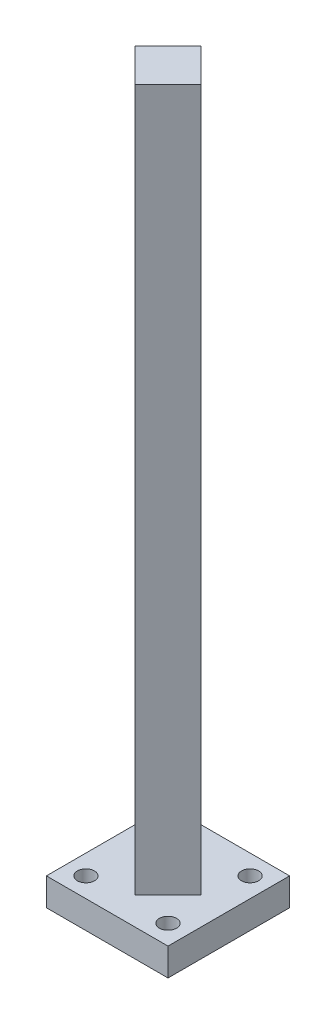
ISO-10303-21;
HEADER;
FILE_DESCRIPTION(('STEP AP214'),'2;1');
FILE_NAME('part.step','',(''),(''),'','','');
FILE_SCHEMA(('AUTOMOTIVE_DESIGN { 1 0 10303 214 1 1 1 1 }'));
ENDSEC;
DATA;
#1=APPLICATION_CONTEXT('core data for automotive mechanical design processes');
#2=APPLICATION_PROTOCOL_DEFINITION('international standard','automotive_design',2000,#1);
#3=PRODUCT_CONTEXT('',#1,'mechanical');
#4=PRODUCT('Part','Part','',(#3));
#5=PRODUCT_RELATED_PRODUCT_CATEGORY('part','',(#4));
#6=PRODUCT_DEFINITION_FORMATION('','',#4);
#7=PRODUCT_DEFINITION_CONTEXT('part definition',#1,'design');
#8=PRODUCT_DEFINITION('design','',#6,#7);
#9=PRODUCT_DEFINITION_SHAPE('','',#8);
#10=(LENGTH_UNIT() NAMED_UNIT(*) SI_UNIT(.MILLI.,.METRE.));
#11=(NAMED_UNIT(*) PLANE_ANGLE_UNIT() SI_UNIT($,.RADIAN.));
#12=(NAMED_UNIT(*) SI_UNIT($,.STERADIAN.) SOLID_ANGLE_UNIT());
#13=UNCERTAINTY_MEASURE_WITH_UNIT(LENGTH_MEASURE(1.E-05),#10,'distance_accuracy_value','');
#14=(GEOMETRIC_REPRESENTATION_CONTEXT(3) GLOBAL_UNCERTAINTY_ASSIGNED_CONTEXT((#13)) GLOBAL_UNIT_ASSIGNED_CONTEXT((#10,
#11,#12)) REPRESENTATION_CONTEXT('',''));
#15=CARTESIAN_POINT('',(0.,0.,0.));
#16=DIRECTION('',(0.,0.,1.));
#17=DIRECTION('',(1.,0.,0.));
#18=AXIS2_PLACEMENT_3D('',#15,#16,#17);
#19=CARTESIAN_POINT('',(0.,5.,0.));
#20=DIRECTION('',(0.,1.,0.));
#21=DIRECTION('',(0.,0.,1.));
#22=AXIS2_PLACEMENT_3D('',#19,#20,#21);
#23=PLANE('',#22);
#24=DIRECTION('',(-0.707106781186545,0.,-0.70710678118655));
#25=VECTOR('',#24,1.);
#26=CARTESIAN_POINT('',(6.00000000000014,5.,0.));
#27=LINE('',#26,#25);
#28=CARTESIAN_POINT('',(6.00000000000014,5.,0.));
#29=VERTEX_POINT('',#28);
#30=CARTESIAN_POINT('',(1.65523303187956E-13,5.,-6.));
#31=VERTEX_POINT('',#30);
#32=EDGE_CURVE('E55',#29,#31,#27,.T.);
#33=ORIENTED_EDGE('',*,*,#32,.F.);
#34=DIRECTION('',(0.70710678118655,0.,-0.707106781186545));
#35=VECTOR('',#34,1.);
#36=CARTESIAN_POINT('',(1.23625527121837E-13,5.,6.));
#37=LINE('',#36,#35);
#38=CARTESIAN_POINT('',(1.23625527121837E-13,5.,6.));
#39=VERTEX_POINT('',#38);
#40=EDGE_CURVE('E59',#39,#29,#37,.T.);
#41=ORIENTED_EDGE('',*,*,#40,.F.);
#42=DIRECTION('',(0.707106781186545,0.,0.70710678118655));
#43=VECTOR('',#42,1.);
#44=CARTESIAN_POINT('',(-5.99999999999986,5.,0.));
#45=LINE('',#44,#43);
#46=CARTESIAN_POINT('',(-5.99999999999986,5.,0.));
#47=VERTEX_POINT('',#46);
#48=EDGE_CURVE('E368',#47,#39,#45,.T.);
#49=ORIENTED_EDGE('',*,*,#48,.F.);
#50=DIRECTION('',(-0.70710678118655,0.,0.707106781186545));
#51=VECTOR('',#50,1.);
#52=CARTESIAN_POINT('',(1.65523303187956E-13,5.,-6.));
#53=LINE('',#52,#51);
#54=EDGE_CURVE('E378',#31,#47,#53,.T.);
#55=ORIENTED_EDGE('',*,*,#54,.F.);
#56=EDGE_LOOP('',(#33,#41,#49,#55));
#57=FACE_BOUND('',#56,.T.);
#58=CARTESIAN_POINT('',(7.42462120245917,5.,7.42462120245833));
#59=DIRECTION('',(0.,1.,0.));
#60=DIRECTION('',(0.,0.,1.));
#61=AXIS2_PLACEMENT_3D('',#58,#59,#60);
#62=CIRCLE('',#61,1.55000000000059);
#63=CARTESIAN_POINT('',(7.42462120245917,5.,8.97462120245892));
#64=VERTEX_POINT('',#63);
#65=EDGE_CURVE('E143',#64,#64,#62,.T.);
#66=ORIENTED_EDGE('',*,*,#65,.F.);
#67=EDGE_LOOP('',(#66));
#68=FACE_BOUND('',#67,.T.);
#69=CARTESIAN_POINT('',(-7.42462120245875,5.,-7.42462120245875));
#70=DIRECTION('',(0.,1.,0.));
#71=DIRECTION('',(0.,0.,1.));
#72=AXIS2_PLACEMENT_3D('',#69,#70,#71);
#73=CIRCLE('',#72,1.55);
#74=CARTESIAN_POINT('',(-7.42462120245875,5.,-5.87462120245875));
#75=VERTEX_POINT('',#74);
#76=EDGE_CURVE('E159',#75,#75,#73,.T.);
#77=ORIENTED_EDGE('',*,*,#76,.F.);
#78=EDGE_LOOP('',(#77));
#79=FACE_BOUND('',#78,.T.);
#80=DIRECTION('',(0.,0.,-1.));
#81=VECTOR('',#80,1.);
#82=CARTESIAN_POINT('',(11.,5.,-11.));
#83=LINE('',#82,#81);
#84=CARTESIAN_POINT('',(11.,5.,11.));
#85=VERTEX_POINT('',#84);
#86=CARTESIAN_POINT('',(11.,5.,-11.));
#87=VERTEX_POINT('',#86);
#88=EDGE_CURVE('E167',#85,#87,#83,.T.);
#89=ORIENTED_EDGE('',*,*,#88,.T.);
#90=DIRECTION('',(-1.,0.,0.));
#91=VECTOR('',#90,1.);
#92=CARTESIAN_POINT('',(-11.,5.,-11.));
#93=LINE('',#92,#91);
#94=CARTESIAN_POINT('',(-11.,5.,-11.));
#95=VERTEX_POINT('',#94);
#96=EDGE_CURVE('E171',#87,#95,#93,.T.);
#97=ORIENTED_EDGE('',*,*,#96,.T.);
#98=DIRECTION('',(0.,0.,1.));
#99=VECTOR('',#98,1.);
#100=CARTESIAN_POINT('',(-11.,5.,-11.));
#101=LINE('',#100,#99);
#102=CARTESIAN_POINT('',(-11.,5.,11.));
#103=VERTEX_POINT('',#102);
#104=EDGE_CURVE('E175',#95,#103,#101,.T.);
#105=ORIENTED_EDGE('',*,*,#104,.T.);
#106=DIRECTION('',(1.,0.,0.));
#107=VECTOR('',#106,1.);
#108=CARTESIAN_POINT('',(-11.,5.,11.));
#109=LINE('',#108,#107);
#110=EDGE_CURVE('E178',#103,#85,#109,.T.);
#111=ORIENTED_EDGE('',*,*,#110,.T.);
#112=EDGE_LOOP('',(#89,#97,#105,#111));
#113=FACE_BOUND('',#112,.T.);
#114=CARTESIAN_POINT('',(7.42462120245875,5.,-7.42462120245917));
#115=DIRECTION('',(0.,1.,0.));
#116=DIRECTION('',(0.,0.,1.));
#117=AXIS2_PLACEMENT_3D('',#114,#115,#116);
#118=CIRCLE('',#117,1.55000000000044);
#119=CARTESIAN_POINT('',(7.42462120245875,5.,-5.87462120245873));
#120=VERTEX_POINT('',#119);
#121=EDGE_CURVE('E151',#120,#120,#118,.T.);
#122=ORIENTED_EDGE('',*,*,#121,.F.);
#123=EDGE_LOOP('',(#122));
#124=FACE_BOUND('',#123,.T.);
#125=CARTESIAN_POINT('',(-7.42462120245833,5.,7.42462120245875));
#126=DIRECTION('',(0.,1.,0.));
#127=DIRECTION('',(0.,0.,1.));
#128=AXIS2_PLACEMENT_3D('',#125,#126,#127);
#129=CIRCLE('',#128,1.55000000000023);
#130=CARTESIAN_POINT('',(-7.42462120245833,5.,8.97462120245898));
#131=VERTEX_POINT('',#130);
#132=EDGE_CURVE('E133',#131,#131,#129,.T.);
#133=ORIENTED_EDGE('',*,*,#132,.F.);
#134=EDGE_LOOP('',(#133));
#135=FACE_BOUND('',#134,.T.);
#136=ADVANCED_FACE('F39',(#57,#68,#79,#113,#124,#135),#23,.T.);
#137=CARTESIAN_POINT('',(0.,0.,0.));
#138=DIRECTION('',(0.,1.,0.));
#139=DIRECTION('',(0.,0.,1.));
#140=AXIS2_PLACEMENT_3D('',#137,#138,#139);
#141=PLANE('',#140);
#142=DIRECTION('',(0.,0.,-1.));
#143=VECTOR('',#142,1.);
#144=CARTESIAN_POINT('',(11.,0.,-11.));
#145=LINE('',#144,#143);
#146=CARTESIAN_POINT('',(11.,0.,11.));
#147=VERTEX_POINT('',#146);
#148=CARTESIAN_POINT('',(11.,0.,-11.));
#149=VERTEX_POINT('',#148);
#150=EDGE_CURVE('E163',#147,#149,#145,.T.);
#151=ORIENTED_EDGE('',*,*,#150,.F.);
#152=DIRECTION('',(1.,0.,0.));
#153=VECTOR('',#152,1.);
#154=CARTESIAN_POINT('',(-11.,0.,11.));
#155=LINE('',#154,#153);
#156=CARTESIAN_POINT('',(-11.,0.,11.));
#157=VERTEX_POINT('',#156);
#158=EDGE_CURVE('E172',#157,#147,#155,.T.);
#159=ORIENTED_EDGE('',*,*,#158,.F.);
#160=DIRECTION('',(0.,0.,1.));
#161=VECTOR('',#160,1.);
#162=CARTESIAN_POINT('',(-11.,0.,-11.));
#163=LINE('',#162,#161);
#164=CARTESIAN_POINT('',(-11.,0.,-11.));
#165=VERTEX_POINT('',#164);
#166=EDGE_CURVE('E188',#165,#157,#163,.T.);
#167=ORIENTED_EDGE('',*,*,#166,.F.);
#168=DIRECTION('',(-1.,0.,0.));
#169=VECTOR('',#168,1.);
#170=CARTESIAN_POINT('',(-11.,0.,-11.));
#171=LINE('',#170,#169);
#172=EDGE_CURVE('E185',#149,#165,#171,.T.);
#173=ORIENTED_EDGE('',*,*,#172,.F.);
#174=EDGE_LOOP('',(#151,#159,#167,#173));
#175=FACE_BOUND('',#174,.T.);
#176=CARTESIAN_POINT('',(-7.42462120245875,0.,-7.42462120245875));
#177=DIRECTION('',(0.,1.,0.));
#178=DIRECTION('',(0.,0.,1.));
#179=AXIS2_PLACEMENT_3D('',#176,#177,#178);
#180=CIRCLE('',#179,1.55);
#181=CARTESIAN_POINT('',(-7.42462120245875,0.,-5.87462120245875));
#182=VERTEX_POINT('',#181);
#183=EDGE_CURVE('E155',#182,#182,#180,.T.);
#184=ORIENTED_EDGE('',*,*,#183,.T.);
#185=EDGE_LOOP('',(#184));
#186=FACE_BOUND('',#185,.T.);
#187=CARTESIAN_POINT('',(7.42462120245875,0.,-7.42462120245917));
#188=DIRECTION('',(0.,1.,0.));
#189=DIRECTION('',(0.,0.,1.));
#190=AXIS2_PLACEMENT_3D('',#187,#188,#189);
#191=CIRCLE('',#190,1.55000000000044);
#192=CARTESIAN_POINT('',(7.42462120245875,0.,-5.87462120245873));
#193=VERTEX_POINT('',#192);
#194=EDGE_CURVE('E147',#193,#193,#191,.T.);
#195=ORIENTED_EDGE('',*,*,#194,.T.);
#196=EDGE_LOOP('',(#195));
#197=FACE_BOUND('',#196,.T.);
#198=CARTESIAN_POINT('',(7.42462120245917,0.,7.42462120245833));
#199=DIRECTION('',(0.,1.,0.));
#200=DIRECTION('',(0.,0.,1.));
#201=AXIS2_PLACEMENT_3D('',#198,#199,#200);
#202=CIRCLE('',#201,1.55000000000059);
#203=CARTESIAN_POINT('',(7.42462120245917,0.,8.97462120245892));
#204=VERTEX_POINT('',#203);
#205=EDGE_CURVE('E141',#204,#204,#202,.T.);
#206=ORIENTED_EDGE('',*,*,#205,.T.);
#207=EDGE_LOOP('',(#206));
#208=FACE_BOUND('',#207,.T.);
#209=CARTESIAN_POINT('',(-7.42462120245833,0.,7.42462120245875));
#210=DIRECTION('',(0.,1.,0.));
#211=DIRECTION('',(0.,0.,1.));
#212=AXIS2_PLACEMENT_3D('',#209,#210,#211);
#213=CIRCLE('',#212,1.55000000000023);
#214=CARTESIAN_POINT('',(-7.42462120245833,0.,8.97462120245898));
#215=VERTEX_POINT('',#214);
#216=EDGE_CURVE('E128',#215,#215,#213,.T.);
#217=ORIENTED_EDGE('',*,*,#216,.T.);
#218=EDGE_LOOP('',(#217));
#219=FACE_BOUND('',#218,.T.);
#220=ADVANCED_FACE('F211',(#175,#186,#197,#208,#219),#141,.F.);
#221=CARTESIAN_POINT('',(11.,5.,-11.));
#222=DIRECTION('',(-1.,0.,0.));
#223=DIRECTION('',(0.,0.,1.));
#224=AXIS2_PLACEMENT_3D('',#221,#222,#223);
#225=PLANE('',#224);
#226=ORIENTED_EDGE('',*,*,#150,.T.);
#227=DIRECTION('',(0.,-1.,0.));
#228=VECTOR('',#227,1.);
#229=CARTESIAN_POINT('',(11.,5.,-11.));
#230=LINE('',#229,#228);
#231=EDGE_CURVE('E11',#87,#149,#230,.T.);
#232=ORIENTED_EDGE('',*,*,#231,.F.);
#233=ORIENTED_EDGE('',*,*,#88,.F.);
#234=DIRECTION('',(0.,-1.,0.));
#235=VECTOR('',#234,1.);
#236=CARTESIAN_POINT('',(11.,5.,11.));
#237=LINE('',#236,#235);
#238=EDGE_CURVE('E181',#85,#147,#237,.T.);
#239=ORIENTED_EDGE('',*,*,#238,.T.);
#240=EDGE_LOOP('',(#226,#232,#233,#239));
#241=FACE_BOUND('',#240,.T.);
#242=ADVANCED_FACE('F41',(#241),#225,.F.);
#243=CARTESIAN_POINT('',(-11.,5.,-11.));
#244=DIRECTION('',(0.,0.,1.));
#245=DIRECTION('',(1.,0.,0.));
#246=AXIS2_PLACEMENT_3D('',#243,#244,#245);
#247=PLANE('',#246);
#248=ORIENTED_EDGE('',*,*,#172,.T.);
#249=DIRECTION('',(0.,-1.,0.));
#250=VECTOR('',#249,1.);
#251=CARTESIAN_POINT('',(-11.,5.,-11.));
#252=LINE('',#251,#250);
#253=EDGE_CURVE('E48',#95,#165,#252,.T.);
#254=ORIENTED_EDGE('',*,*,#253,.F.);
#255=ORIENTED_EDGE('',*,*,#96,.F.);
#256=ORIENTED_EDGE('',*,*,#231,.T.);
#257=EDGE_LOOP('',(#248,#254,#255,#256));
#258=FACE_BOUND('',#257,.T.);
#259=ADVANCED_FACE('F222',(#258),#247,.F.);
#260=CARTESIAN_POINT('',(-11.,5.,-11.));
#261=DIRECTION('',(1.,0.,0.));
#262=DIRECTION('',(0.,0.,-1.));
#263=AXIS2_PLACEMENT_3D('',#260,#261,#262);
#264=PLANE('',#263);
#265=ORIENTED_EDGE('',*,*,#166,.T.);
#266=DIRECTION('',(0.,-1.,0.));
#267=VECTOR('',#266,1.);
#268=CARTESIAN_POINT('',(-11.,5.,11.));
#269=LINE('',#268,#267);
#270=EDGE_CURVE('E196',#103,#157,#269,.T.);
#271=ORIENTED_EDGE('',*,*,#270,.F.);
#272=ORIENTED_EDGE('',*,*,#104,.F.);
#273=ORIENTED_EDGE('',*,*,#253,.T.);
#274=EDGE_LOOP('',(#265,#271,#272,#273));
#275=FACE_BOUND('',#274,.T.);
#276=ADVANCED_FACE('F205',(#275),#264,.F.);
#277=CARTESIAN_POINT('',(-11.,5.,11.));
#278=DIRECTION('',(0.,0.,-1.));
#279=DIRECTION('',(-1.,0.,0.));
#280=AXIS2_PLACEMENT_3D('',#277,#278,#279);
#281=PLANE('',#280);
#282=ORIENTED_EDGE('',*,*,#158,.T.);
#283=ORIENTED_EDGE('',*,*,#238,.F.);
#284=ORIENTED_EDGE('',*,*,#110,.F.);
#285=ORIENTED_EDGE('',*,*,#270,.T.);
#286=EDGE_LOOP('',(#282,#283,#284,#285));
#287=FACE_BOUND('',#286,.T.);
#288=ADVANCED_FACE('F215',(#287),#281,.F.);
#289=CARTESIAN_POINT('',(-7.42462120245875,5.,-7.42462120245875));
#290=DIRECTION('',(0.,-1.,0.));
#291=DIRECTION('',(0.,0.,-1.));
#292=AXIS2_PLACEMENT_3D('',#289,#290,#291);
#293=CYLINDRICAL_SURFACE('',#292,1.55);
#294=ORIENTED_EDGE('',*,*,#76,.T.);
#295=EDGE_LOOP('',(#294));
#296=FACE_BOUND('',#295,.T.);
#297=ORIENTED_EDGE('',*,*,#183,.F.);
#298=EDGE_LOOP('',(#297));
#299=FACE_BOUND('',#298,.T.);
#300=ADVANCED_FACE('F237',(#296,#299),#293,.F.);
#301=CARTESIAN_POINT('',(7.42462120245875,5.,-7.42462120245917));
#302=DIRECTION('',(0.,-1.,0.));
#303=DIRECTION('',(0.,0.,-1.));
#304=AXIS2_PLACEMENT_3D('',#301,#302,#303);
#305=CYLINDRICAL_SURFACE('',#304,1.55000000000044);
#306=ORIENTED_EDGE('',*,*,#121,.T.);
#307=EDGE_LOOP('',(#306));
#308=FACE_BOUND('',#307,.T.);
#309=ORIENTED_EDGE('',*,*,#194,.F.);
#310=EDGE_LOOP('',(#309));
#311=FACE_BOUND('',#310,.T.);
#312=ADVANCED_FACE('F244',(#308,#311),#305,.F.);
#313=CARTESIAN_POINT('',(7.42462120245917,5.,7.42462120245833));
#314=DIRECTION('',(0.,-1.,0.));
#315=DIRECTION('',(0.,0.,-1.));
#316=AXIS2_PLACEMENT_3D('',#313,#314,#315);
#317=CYLINDRICAL_SURFACE('',#316,1.55000000000059);
#318=ORIENTED_EDGE('',*,*,#65,.T.);
#319=EDGE_LOOP('',(#318));
#320=FACE_BOUND('',#319,.T.);
#321=ORIENTED_EDGE('',*,*,#205,.F.);
#322=EDGE_LOOP('',(#321));
#323=FACE_BOUND('',#322,.T.);
#324=ADVANCED_FACE('F249',(#320,#323),#317,.F.);
#325=CARTESIAN_POINT('',(-7.42462120245833,5.,7.42462120245875));
#326=DIRECTION('',(0.,-1.,0.));
#327=DIRECTION('',(0.,0.,-1.));
#328=AXIS2_PLACEMENT_3D('',#325,#326,#327);
#329=CYLINDRICAL_SURFACE('',#328,1.55000000000023);
#330=ORIENTED_EDGE('',*,*,#132,.T.);
#331=EDGE_LOOP('',(#330));
#332=FACE_BOUND('',#331,.T.);
#333=ORIENTED_EDGE('',*,*,#216,.F.);
#334=EDGE_LOOP('',(#333));
#335=FACE_BOUND('',#334,.T.);
#336=ADVANCED_FACE('F261',(#332,#335),#329,.F.);
#337=CARTESIAN_POINT('',(6.00000000000014,132.,0.));
#338=DIRECTION('',(-0.70710678118655,0.,0.707106781186545));
#339=DIRECTION('',(0.707106781186545,0.,0.70710678118655));
#340=AXIS2_PLACEMENT_3D('',#337,#338,#339);
#341=PLANE('',#340);
#342=ORIENTED_EDGE('',*,*,#32,.T.);
#343=DIRECTION('',(0.,-1.,0.));
#344=VECTOR('',#343,1.);
#345=CARTESIAN_POINT('',(1.65523303187956E-13,132.,-6.));
#346=LINE('',#345,#344);
#347=CARTESIAN_POINT('',(1.65523303187956E-13,132.,-6.));
#348=VERTEX_POINT('',#347);
#349=EDGE_CURVE('E108',#348,#31,#346,.T.);
#350=ORIENTED_EDGE('',*,*,#349,.F.);
#351=DIRECTION('',(-0.707106781186545,0.,-0.70710678118655));
#352=VECTOR('',#351,1.);
#353=CARTESIAN_POINT('',(6.00000000000014,132.,0.));
#354=LINE('',#353,#352);
#355=CARTESIAN_POINT('',(6.00000000000014,132.,0.));
#356=VERTEX_POINT('',#355);
#357=EDGE_CURVE('E115',#356,#348,#354,.T.);
#358=ORIENTED_EDGE('',*,*,#357,.F.);
#359=DIRECTION('',(0.,-1.,0.));
#360=VECTOR('',#359,1.);
#361=CARTESIAN_POINT('',(6.00000000000014,132.,0.));
#362=LINE('',#361,#360);
#363=EDGE_CURVE('E365',#356,#29,#362,.T.);
#364=ORIENTED_EDGE('',*,*,#363,.T.);
#365=EDGE_LOOP('',(#342,#350,#358,#364));
#366=FACE_BOUND('',#365,.T.);
#367=ADVANCED_FACE('F126',(#366),#341,.F.);
#368=CARTESIAN_POINT('',(1.65523303187956E-13,132.,-6.));
#369=DIRECTION('',(0.707106781186545,0.,0.70710678118655));
#370=DIRECTION('',(0.70710678118655,0.,-0.707106781186545));
#371=AXIS2_PLACEMENT_3D('',#368,#369,#370);
#372=PLANE('',#371);
#373=ORIENTED_EDGE('',*,*,#54,.T.);
#374=DIRECTION('',(0.,-1.,0.));
#375=VECTOR('',#374,1.);
#376=CARTESIAN_POINT('',(-5.99999999999986,132.,0.));
#377=LINE('',#376,#375);
#378=CARTESIAN_POINT('',(-5.99999999999986,132.,0.));
#379=VERTEX_POINT('',#378);
#380=EDGE_CURVE('E110',#379,#47,#377,.T.);
#381=ORIENTED_EDGE('',*,*,#380,.F.);
#382=DIRECTION('',(-0.70710678118655,0.,0.707106781186545));
#383=VECTOR('',#382,1.);
#384=CARTESIAN_POINT('',(1.65523303187956E-13,132.,-6.));
#385=LINE('',#384,#383);
#386=EDGE_CURVE('E103',#348,#379,#385,.T.);
#387=ORIENTED_EDGE('',*,*,#386,.F.);
#388=ORIENTED_EDGE('',*,*,#349,.T.);
#389=EDGE_LOOP('',(#373,#381,#387,#388));
#390=FACE_BOUND('',#389,.T.);
#391=ADVANCED_FACE('F106',(#390),#372,.F.);
#392=CARTESIAN_POINT('',(-5.99999999999986,132.,0.));
#393=DIRECTION('',(0.70710678118655,0.,-0.707106781186545));
#394=DIRECTION('',(-0.707106781186545,0.,-0.70710678118655));
#395=AXIS2_PLACEMENT_3D('',#392,#393,#394);
#396=PLANE('',#395);
#397=ORIENTED_EDGE('',*,*,#48,.T.);
#398=DIRECTION('',(0.,-1.,0.));
#399=VECTOR('',#398,1.);
#400=CARTESIAN_POINT('',(1.23625527121837E-13,132.,6.));
#401=LINE('',#400,#399);
#402=CARTESIAN_POINT('',(1.23625527121837E-13,132.,6.));
#403=VERTEX_POINT('',#402);
#404=EDGE_CURVE('E135',#403,#39,#401,.T.);
#405=ORIENTED_EDGE('',*,*,#404,.F.);
#406=DIRECTION('',(0.707106781186545,0.,0.70710678118655));
#407=VECTOR('',#406,1.);
#408=CARTESIAN_POINT('',(-5.99999999999986,132.,0.));
#409=LINE('',#408,#407);
#410=EDGE_CURVE('E114',#379,#403,#409,.T.);
#411=ORIENTED_EDGE('',*,*,#410,.F.);
#412=ORIENTED_EDGE('',*,*,#380,.T.);
#413=EDGE_LOOP('',(#397,#405,#411,#412));
#414=FACE_BOUND('',#413,.T.);
#415=ADVANCED_FACE('F275',(#414),#396,.F.);
#416=CARTESIAN_POINT('',(1.23625527121837E-13,132.,6.));
#417=DIRECTION('',(-0.707106781186545,0.,-0.70710678118655));
#418=DIRECTION('',(-0.70710678118655,0.,0.707106781186545));
#419=AXIS2_PLACEMENT_3D('',#416,#417,#418);
#420=PLANE('',#419);
#421=ORIENTED_EDGE('',*,*,#40,.T.);
#422=ORIENTED_EDGE('',*,*,#363,.F.);
#423=DIRECTION('',(0.70710678118655,0.,-0.707106781186545));
#424=VECTOR('',#423,1.);
#425=CARTESIAN_POINT('',(1.23625527121837E-13,132.,6.));
#426=LINE('',#425,#424);
#427=EDGE_CURVE('E120',#403,#356,#426,.T.);
#428=ORIENTED_EDGE('',*,*,#427,.F.);
#429=ORIENTED_EDGE('',*,*,#404,.T.);
#430=EDGE_LOOP('',(#421,#422,#428,#429));
#431=FACE_BOUND('',#430,.T.);
#432=ADVANCED_FACE('F278',(#431),#420,.F.);
#433=CARTESIAN_POINT('',(0.,132.,0.));
#434=DIRECTION('',(0.,1.,0.));
#435=DIRECTION('',(0.,0.,1.));
#436=AXIS2_PLACEMENT_3D('',#433,#434,#435);
#437=PLANE('',#436);
#438=ORIENTED_EDGE('',*,*,#357,.T.);
#439=ORIENTED_EDGE('',*,*,#386,.T.);
#440=ORIENTED_EDGE('',*,*,#410,.T.);
#441=ORIENTED_EDGE('',*,*,#427,.T.);
#442=EDGE_LOOP('',(#438,#439,#440,#441));
#443=FACE_BOUND('',#442,.T.);
#444=ADVANCED_FACE('F118',(#443),#437,.T.);
#445=CLOSED_SHELL('',(#136,#220,#242,#259,#276,#288,#300,#312,#324,#336,#367,#391,#415,#432,#444));
#446=MANIFOLD_SOLID_BREP('B2',#445);
#447=ADVANCED_BREP_SHAPE_REPRESENTATION('',(#18,#446),#14);
#448=SHAPE_DEFINITION_REPRESENTATION(#9,#447);
ENDSEC;
END-ISO-10303-21;
